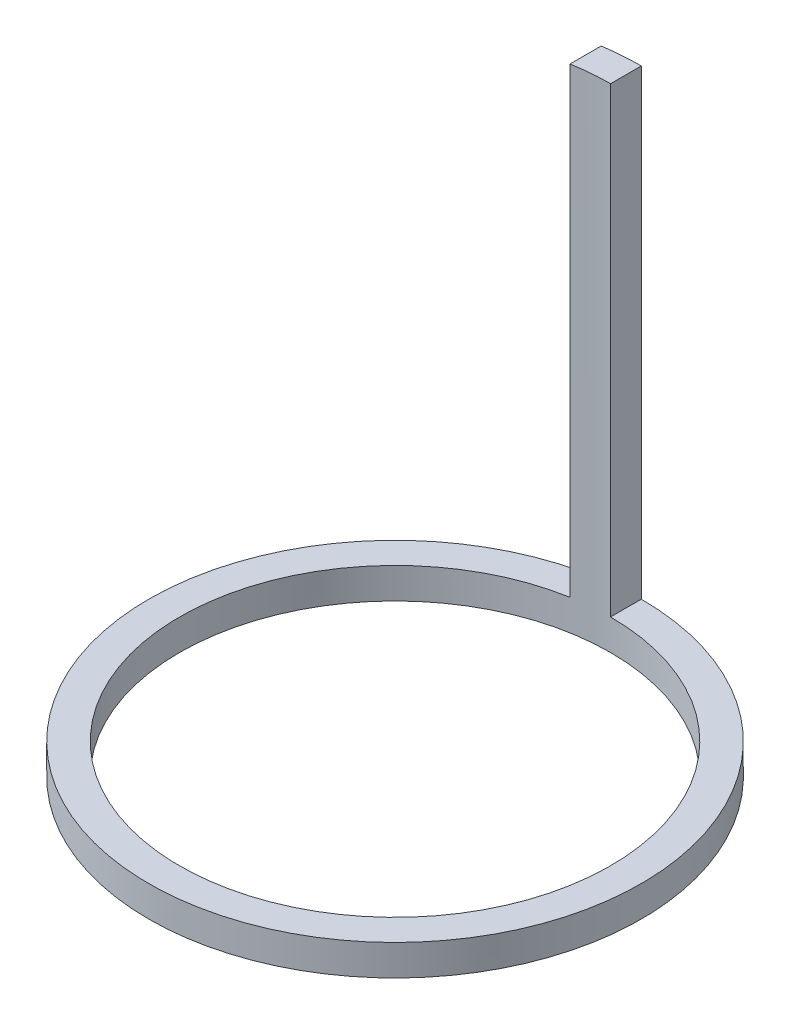
ISO-10303-21;
HEADER;
FILE_DESCRIPTION(('STEP AP214'),'2;1');
FILE_NAME('part.step','',(''),(''),'','','');
FILE_SCHEMA(('AUTOMOTIVE_DESIGN { 1 0 10303 214 1 1 1 1 }'));
ENDSEC;
DATA;
#1=APPLICATION_CONTEXT('core data for automotive mechanical design processes');
#2=APPLICATION_PROTOCOL_DEFINITION('international standard','automotive_design',2000,#1);
#3=PRODUCT_CONTEXT('',#1,'mechanical');
#4=PRODUCT('Part','Part','',(#3));
#5=PRODUCT_RELATED_PRODUCT_CATEGORY('part','',(#4));
#6=PRODUCT_DEFINITION_FORMATION('','',#4);
#7=PRODUCT_DEFINITION_CONTEXT('part definition',#1,'design');
#8=PRODUCT_DEFINITION('design','',#6,#7);
#9=PRODUCT_DEFINITION_SHAPE('','',#8);
#10=(LENGTH_UNIT() NAMED_UNIT(*) SI_UNIT(.MILLI.,.METRE.));
#11=(NAMED_UNIT(*) PLANE_ANGLE_UNIT() SI_UNIT($,.RADIAN.));
#12=(NAMED_UNIT(*) SI_UNIT($,.STERADIAN.) SOLID_ANGLE_UNIT());
#13=UNCERTAINTY_MEASURE_WITH_UNIT(LENGTH_MEASURE(1.E-05),#10,'distance_accuracy_value','');
#14=(GEOMETRIC_REPRESENTATION_CONTEXT(3) GLOBAL_UNCERTAINTY_ASSIGNED_CONTEXT((#13)) GLOBAL_UNIT_ASSIGNED_CONTEXT((#10,
#11,#12)) REPRESENTATION_CONTEXT('',''));
#15=CARTESIAN_POINT('',(0.,0.,0.));
#16=DIRECTION('',(0.,0.,1.));
#17=DIRECTION('',(1.,0.,0.));
#18=AXIS2_PLACEMENT_3D('',#15,#16,#17);
#19=CARTESIAN_POINT('',(0.,6.35,0.));
#20=DIRECTION('',(0.,1.,0.));
#21=DIRECTION('',(0.,0.,1.));
#22=AXIS2_PLACEMENT_3D('',#19,#20,#21);
#23=PLANE('',#22);
#24=CARTESIAN_POINT('',(0.,6.35,0.));
#25=DIRECTION('',(0.,1.,0.));
#26=DIRECTION('',(0.,0.,1.));
#27=AXIS2_PLACEMENT_3D('',#24,#25,#26);
#28=CIRCLE('',#27,50.8);
#29=CARTESIAN_POINT('',(-7.7046755243576,6.35,-50.2123289149624));
#30=VERTEX_POINT('',#29);
#31=CARTESIAN_POINT('',(0.,6.35,-50.8));
#32=VERTEX_POINT('',#31);
#33=EDGE_CURVE('E11',#30,#32,#28,.T.);
#34=ORIENTED_EDGE('',*,*,#33,.T.);
#35=DIRECTION('',(0.,0.,1.));
#36=VECTOR('',#35,1.);
#37=CARTESIAN_POINT('',(0.,6.35,0.));
#38=LINE('',#37,#36);
#39=CARTESIAN_POINT('',(0.,6.35,-44.45));
#40=VERTEX_POINT('',#39);
#41=EDGE_CURVE('E47',#32,#40,#38,.T.);
#42=ORIENTED_EDGE('',*,*,#41,.T.);
#43=CARTESIAN_POINT('',(0.,6.35,0.));
#44=DIRECTION('',(0.,1.,0.));
#45=DIRECTION('',(0.,0.,1.));
#46=AXIS2_PLACEMENT_3D('',#43,#44,#45);
#47=CIRCLE('',#46,44.45);
#48=CARTESIAN_POINT('',(-7.7046755243576,6.35,-43.7771684221852));
#49=VERTEX_POINT('',#48);
#50=EDGE_CURVE('E106',#49,#40,#47,.T.);
#51=ORIENTED_EDGE('',*,*,#50,.F.);
#52=DIRECTION('',(0.,0.,1.));
#53=VECTOR('',#52,1.);
#54=CARTESIAN_POINT('',(-7.7046755243576,6.35,0.));
#55=LINE('',#54,#53);
#56=EDGE_CURVE('E52',#30,#49,#55,.T.);
#57=ORIENTED_EDGE('',*,*,#56,.F.);
#58=EDGE_LOOP('',(#34,#42,#51,#57));
#59=FACE_BOUND('',#58,.T.);
#60=ADVANCED_FACE('F33',(#59),#23,.T.);
#61=CARTESIAN_POINT('',(0.,0.,0.));
#62=DIRECTION('',(0.,1.,0.));
#63=DIRECTION('',(0.,0.,1.));
#64=AXIS2_PLACEMENT_3D('',#61,#62,#63);
#65=PLANE('',#64);
#66=CARTESIAN_POINT('',(0.,0.,0.));
#67=DIRECTION('',(0.,1.,0.));
#68=DIRECTION('',(0.,0.,1.));
#69=AXIS2_PLACEMENT_3D('',#66,#67,#68);
#70=CIRCLE('',#69,50.8);
#71=CARTESIAN_POINT('',(0.,0.,50.8));
#72=VERTEX_POINT('',#71);
#73=EDGE_CURVE('E37',#72,#72,#70,.T.);
#74=ORIENTED_EDGE('',*,*,#73,.F.);
#75=EDGE_LOOP('',(#74));
#76=FACE_BOUND('',#75,.T.);
#77=CARTESIAN_POINT('',(0.,0.,0.));
#78=DIRECTION('',(0.,1.,0.));
#79=DIRECTION('',(0.,0.,1.));
#80=AXIS2_PLACEMENT_3D('',#77,#78,#79);
#81=CIRCLE('',#80,44.45);
#82=CARTESIAN_POINT('',(0.,0.,44.45));
#83=VERTEX_POINT('',#82);
#84=EDGE_CURVE('E79',#83,#83,#81,.T.);
#85=ORIENTED_EDGE('',*,*,#84,.T.);
#86=EDGE_LOOP('',(#85));
#87=FACE_BOUND('',#86,.T.);
#88=ADVANCED_FACE('F111',(#76,#87),#65,.F.);
#89=CARTESIAN_POINT('',(0.,6.35,0.));
#90=DIRECTION('',(0.,-1.,0.));
#91=DIRECTION('',(0.,0.,-1.));
#92=AXIS2_PLACEMENT_3D('',#89,#90,#91);
#93=CYLINDRICAL_SURFACE('',#92,50.8);
#94=ORIENTED_EDGE('',*,*,#33,.F.);
#95=DIRECTION('',(0.,-1.,0.));
#96=VECTOR('',#95,1.);
#97=CARTESIAN_POINT('',(-7.7046755243576,101.6,-50.2123289149624));
#98=LINE('',#97,#96);
#99=CARTESIAN_POINT('',(-7.7046755243576,101.6,-50.2123289149624));
#100=VERTEX_POINT('',#99);
#101=EDGE_CURVE('E80',#100,#30,#98,.T.);
#102=ORIENTED_EDGE('',*,*,#101,.F.);
#103=CARTESIAN_POINT('',(0.,101.6,0.));
#104=DIRECTION('',(0.,1.,0.));
#105=DIRECTION('',(0.,0.,1.));
#106=AXIS2_PLACEMENT_3D('',#103,#104,#105);
#107=CIRCLE('',#106,50.8);
#108=CARTESIAN_POINT('',(0.,101.6,-50.8));
#109=VERTEX_POINT('',#108);
#110=EDGE_CURVE('E83',#109,#100,#107,.T.);
#111=ORIENTED_EDGE('',*,*,#110,.F.);
#112=DIRECTION('',(0.,-1.,0.));
#113=VECTOR('',#112,1.);
#114=CARTESIAN_POINT('',(0.,101.6,-50.8));
#115=LINE('',#114,#113);
#116=EDGE_CURVE('E72',#109,#32,#115,.T.);
#117=ORIENTED_EDGE('',*,*,#116,.T.);
#118=EDGE_LOOP('',(#94,#102,#111,#117));
#119=FACE_BOUND('',#118,.T.);
#120=ORIENTED_EDGE('',*,*,#73,.T.);
#121=EDGE_LOOP('',(#120));
#122=FACE_BOUND('',#121,.T.);
#123=ADVANCED_FACE('F35',(#119,#122),#93,.T.);
#124=CARTESIAN_POINT('',(0.,6.35,0.));
#125=DIRECTION('',(0.,-1.,0.));
#126=DIRECTION('',(0.,0.,-1.));
#127=AXIS2_PLACEMENT_3D('',#124,#125,#126);
#128=CYLINDRICAL_SURFACE('',#127,44.45);
#129=ORIENTED_EDGE('',*,*,#50,.T.);
#130=DIRECTION('',(0.,-1.,0.));
#131=VECTOR('',#130,1.);
#132=CARTESIAN_POINT('',(0.,101.6,-44.45));
#133=LINE('',#132,#131);
#134=CARTESIAN_POINT('',(0.,101.6,-44.45));
#135=VERTEX_POINT('',#134);
#136=EDGE_CURVE('E99',#135,#40,#133,.T.);
#137=ORIENTED_EDGE('',*,*,#136,.F.);
#138=CARTESIAN_POINT('',(0.,101.6,0.));
#139=DIRECTION('',(0.,1.,0.));
#140=DIRECTION('',(0.,0.,1.));
#141=AXIS2_PLACEMENT_3D('',#138,#139,#140);
#142=CIRCLE('',#141,44.45);
#143=CARTESIAN_POINT('',(-7.7046755243576,101.6,-43.7771684221852));
#144=VERTEX_POINT('',#143);
#145=EDGE_CURVE('E92',#144,#135,#142,.F.);
#146=ORIENTED_EDGE('',*,*,#145,.F.);
#147=DIRECTION('',(0.,-1.,0.));
#148=VECTOR('',#147,1.);
#149=CARTESIAN_POINT('',(-7.7046755243576,101.6,-43.7771684221852));
#150=LINE('',#149,#148);
#151=EDGE_CURVE('E102',#144,#49,#150,.T.);
#152=ORIENTED_EDGE('',*,*,#151,.T.);
#153=EDGE_LOOP('',(#129,#137,#146,#152));
#154=FACE_BOUND('',#153,.T.);
#155=ORIENTED_EDGE('',*,*,#84,.F.);
#156=EDGE_LOOP('',(#155));
#157=FACE_BOUND('',#156,.T.);
#158=ADVANCED_FACE('F113',(#154,#157),#128,.F.);
#159=CARTESIAN_POINT('',(0.,101.6,0.));
#160=DIRECTION('',(1.,0.,0.));
#161=DIRECTION('',(0.,0.,-1.));
#162=AXIS2_PLACEMENT_3D('',#159,#160,#161);
#163=PLANE('',#162);
#164=ORIENTED_EDGE('',*,*,#41,.F.);
#165=ORIENTED_EDGE('',*,*,#116,.F.);
#166=DIRECTION('',(0.,0.,1.));
#167=VECTOR('',#166,1.);
#168=CARTESIAN_POINT('',(0.,101.6,0.));
#169=LINE('',#168,#167);
#170=EDGE_CURVE('E77',#109,#135,#169,.T.);
#171=ORIENTED_EDGE('',*,*,#170,.T.);
#172=ORIENTED_EDGE('',*,*,#136,.T.);
#173=EDGE_LOOP('',(#164,#165,#171,#172));
#174=FACE_BOUND('',#173,.T.);
#175=ADVANCED_FACE('F74',(#174),#163,.T.);
#176=CARTESIAN_POINT('',(-7.7046755243576,101.6,0.));
#177=DIRECTION('',(1.,0.,0.));
#178=DIRECTION('',(0.,0.,-1.));
#179=AXIS2_PLACEMENT_3D('',#176,#177,#178);
#180=PLANE('',#179);
#181=ORIENTED_EDGE('',*,*,#56,.T.);
#182=ORIENTED_EDGE('',*,*,#151,.F.);
#183=DIRECTION('',(0.,0.,1.));
#184=VECTOR('',#183,1.);
#185=CARTESIAN_POINT('',(-7.7046755243576,101.6,0.));
#186=LINE('',#185,#184);
#187=EDGE_CURVE('E88',#100,#144,#186,.T.);
#188=ORIENTED_EDGE('',*,*,#187,.F.);
#189=ORIENTED_EDGE('',*,*,#101,.T.);
#190=EDGE_LOOP('',(#181,#182,#188,#189));
#191=FACE_BOUND('',#190,.T.);
#192=ADVANCED_FACE('F121',(#191),#180,.F.);
#193=CARTESIAN_POINT('',(0.,101.6,0.));
#194=DIRECTION('',(0.,1.,0.));
#195=DIRECTION('',(0.,0.,1.));
#196=AXIS2_PLACEMENT_3D('',#193,#194,#195);
#197=PLANE('',#196);
#198=ORIENTED_EDGE('',*,*,#170,.F.);
#199=ORIENTED_EDGE('',*,*,#110,.T.);
#200=ORIENTED_EDGE('',*,*,#187,.T.);
#201=ORIENTED_EDGE('',*,*,#145,.T.);
#202=EDGE_LOOP('',(#198,#199,#200,#201));
#203=FACE_BOUND('',#202,.T.);
#204=ADVANCED_FACE('F90',(#203),#197,.T.);
#205=CLOSED_SHELL('',(#60,#88,#123,#158,#175,#192,#204));
#206=MANIFOLD_SOLID_BREP('B2',#205);
#207=ADVANCED_BREP_SHAPE_REPRESENTATION('',(#18,#206),#14);
#208=SHAPE_DEFINITION_REPRESENTATION(#9,#207);
ENDSEC;
END-ISO-10303-21;
